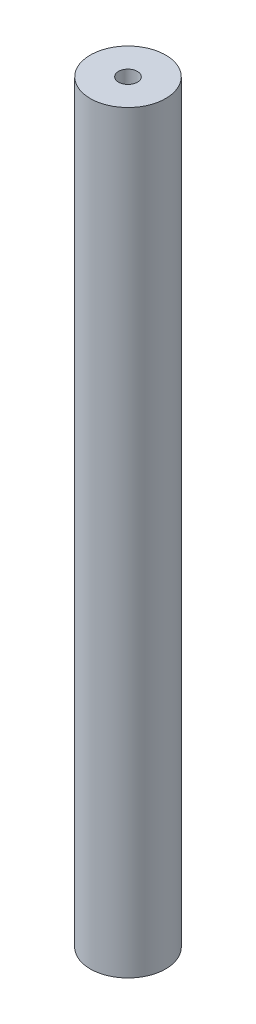
ISO-10303-21;
HEADER;
FILE_DESCRIPTION(('STEP AP214'),'2;1');
FILE_NAME('part.step','',(''),(''),'','','');
FILE_SCHEMA(('AUTOMOTIVE_DESIGN { 1 0 10303 214 1 1 1 1 }'));
ENDSEC;
DATA;
#1=APPLICATION_CONTEXT('core data for automotive mechanical design processes');
#2=APPLICATION_PROTOCOL_DEFINITION('international standard','automotive_design',2000,#1);
#3=PRODUCT_CONTEXT('',#1,'mechanical');
#4=PRODUCT('Part','Part','',(#3));
#5=PRODUCT_RELATED_PRODUCT_CATEGORY('part','',(#4));
#6=PRODUCT_DEFINITION_FORMATION('','',#4);
#7=PRODUCT_DEFINITION_CONTEXT('part definition',#1,'design');
#8=PRODUCT_DEFINITION('design','',#6,#7);
#9=PRODUCT_DEFINITION_SHAPE('','',#8);
#10=(LENGTH_UNIT() NAMED_UNIT(*) SI_UNIT(.MILLI.,.METRE.));
#11=(NAMED_UNIT(*) PLANE_ANGLE_UNIT() SI_UNIT($,.RADIAN.));
#12=(NAMED_UNIT(*) SI_UNIT($,.STERADIAN.) SOLID_ANGLE_UNIT());
#13=UNCERTAINTY_MEASURE_WITH_UNIT(LENGTH_MEASURE(1.E-05),#10,'distance_accuracy_value','');
#14=(GEOMETRIC_REPRESENTATION_CONTEXT(3) GLOBAL_UNCERTAINTY_ASSIGNED_CONTEXT((#13)) GLOBAL_UNIT_ASSIGNED_CONTEXT((#10,
#11,#12)) REPRESENTATION_CONTEXT('',''));
#15=CARTESIAN_POINT('',(0.,0.,0.));
#16=DIRECTION('',(0.,0.,1.));
#17=DIRECTION('',(1.,0.,0.));
#18=AXIS2_PLACEMENT_3D('',#15,#16,#17);
#19=CARTESIAN_POINT('',(0.,508.,0.));
#20=DIRECTION('',(0.,-1.,0.));
#21=DIRECTION('',(0.,0.,-1.));
#22=AXIS2_PLACEMENT_3D('',#19,#20,#21);
#23=CYLINDRICAL_SURFACE('',#22,25.4);
#24=CARTESIAN_POINT('',(0.,508.,0.));
#25=DIRECTION('',(0.,1.,0.));
#26=DIRECTION('',(0.,0.,1.));
#27=AXIS2_PLACEMENT_3D('',#24,#25,#26);
#28=CIRCLE('',#27,25.4);
#29=CARTESIAN_POINT('',(0.,508.,25.4));
#30=VERTEX_POINT('',#29);
#31=EDGE_CURVE('E10',#30,#30,#28,.T.);
#32=ORIENTED_EDGE('',*,*,#31,.F.);
#33=EDGE_LOOP('',(#32));
#34=FACE_BOUND('',#33,.T.);
#35=CARTESIAN_POINT('',(0.,0.,0.));
#36=DIRECTION('',(0.,1.,0.));
#37=DIRECTION('',(0.,0.,1.));
#38=AXIS2_PLACEMENT_3D('',#35,#36,#37);
#39=CIRCLE('',#38,25.4);
#40=CARTESIAN_POINT('',(0.,0.,25.4));
#41=VERTEX_POINT('',#40);
#42=EDGE_CURVE('E34',#41,#41,#39,.T.);
#43=ORIENTED_EDGE('',*,*,#42,.T.);
#44=EDGE_LOOP('',(#43));
#45=FACE_BOUND('',#44,.T.);
#46=ADVANCED_FACE('F31',(#34,#45),#23,.T.);
#47=CARTESIAN_POINT('',(0.,508.,0.));
#48=DIRECTION('',(0.,1.,0.));
#49=DIRECTION('',(0.,0.,1.));
#50=AXIS2_PLACEMENT_3D('',#47,#48,#49);
#51=PLANE('',#50);
#52=CARTESIAN_POINT('',(0.,508.,0.));
#53=DIRECTION('',(0.,1.,0.));
#54=DIRECTION('',(0.,0.,1.));
#55=AXIS2_PLACEMENT_3D('',#52,#53,#54);
#56=CIRCLE('',#55,6.35);
#57=CARTESIAN_POINT('',(0.,508.,6.35));
#58=VERTEX_POINT('',#57);
#59=EDGE_CURVE('E43',#58,#58,#56,.T.);
#60=ORIENTED_EDGE('',*,*,#59,.F.);
#61=EDGE_LOOP('',(#60));
#62=FACE_BOUND('',#61,.T.);
#63=ORIENTED_EDGE('',*,*,#31,.T.);
#64=EDGE_LOOP('',(#63));
#65=FACE_BOUND('',#64,.T.);
#66=ADVANCED_FACE('F58',(#62,#65),#51,.T.);
#67=CARTESIAN_POINT('',(0.,0.,0.));
#68=DIRECTION('',(0.,1.,0.));
#69=DIRECTION('',(0.,0.,1.));
#70=AXIS2_PLACEMENT_3D('',#67,#68,#69);
#71=PLANE('',#70);
#72=CARTESIAN_POINT('',(0.,0.,0.));
#73=DIRECTION('',(0.,1.,0.));
#74=DIRECTION('',(0.,0.,1.));
#75=AXIS2_PLACEMENT_3D('',#72,#73,#74);
#76=CIRCLE('',#75,6.35);
#77=CARTESIAN_POINT('',(0.,0.,6.35));
#78=VERTEX_POINT('',#77);
#79=EDGE_CURVE('E41',#78,#78,#76,.T.);
#80=ORIENTED_EDGE('',*,*,#79,.T.);
#81=EDGE_LOOP('',(#80));
#82=FACE_BOUND('',#81,.T.);
#83=ORIENTED_EDGE('',*,*,#42,.F.);
#84=EDGE_LOOP('',(#83));
#85=FACE_BOUND('',#84,.T.);
#86=ADVANCED_FACE('F49',(#82,#85),#71,.F.);
#87=CARTESIAN_POINT('',(0.,0.,0.));
#88=DIRECTION('',(0.,1.,0.));
#89=DIRECTION('',(0.,0.,1.));
#90=AXIS2_PLACEMENT_3D('',#87,#88,#89);
#91=CYLINDRICAL_SURFACE('',#90,6.35);
#92=ORIENTED_EDGE('',*,*,#79,.F.);
#93=EDGE_LOOP('',(#92));
#94=FACE_BOUND('',#93,.T.);
#95=ORIENTED_EDGE('',*,*,#59,.T.);
#96=EDGE_LOOP('',(#95));
#97=FACE_BOUND('',#96,.T.);
#98=ADVANCED_FACE('F52',(#94,#97),#91,.F.);
#99=CLOSED_SHELL('',(#46,#66,#86,#98));
#100=MANIFOLD_SOLID_BREP('B2',#99);
#101=ADVANCED_BREP_SHAPE_REPRESENTATION('',(#18,#100),#14);
#102=SHAPE_DEFINITION_REPRESENTATION(#9,#101);
ENDSEC;
END-ISO-10303-21;
